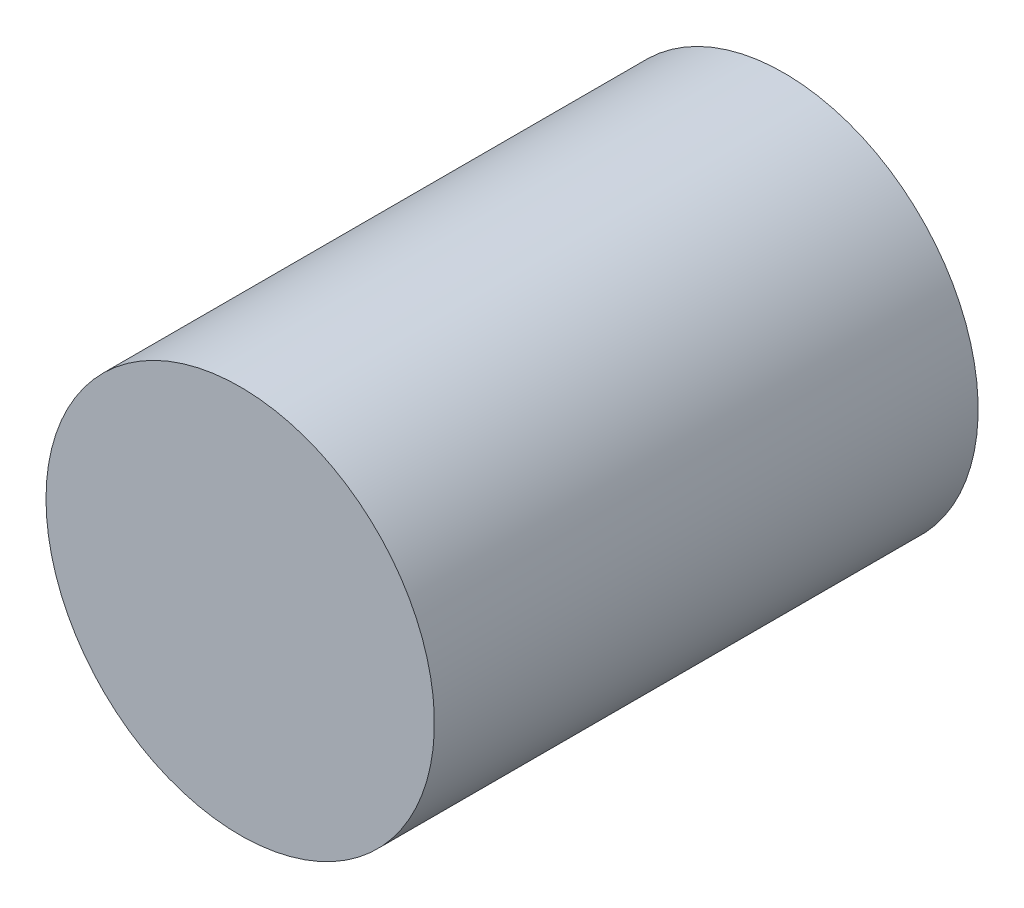
ISO-10303-21;
HEADER;
FILE_DESCRIPTION(('STEP AP214'),'2;1');
FILE_NAME('part.step','',(''),(''),'','','');
FILE_SCHEMA(('AUTOMOTIVE_DESIGN { 1 0 10303 214 1 1 1 1 }'));
ENDSEC;
DATA;
#1=APPLICATION_CONTEXT('core data for automotive mechanical design processes');
#2=APPLICATION_PROTOCOL_DEFINITION('international standard','automotive_design',2000,#1);
#3=PRODUCT_CONTEXT('',#1,'mechanical');
#4=PRODUCT('Part','Part','',(#3));
#5=PRODUCT_RELATED_PRODUCT_CATEGORY('part','',(#4));
#6=PRODUCT_DEFINITION_FORMATION('','',#4);
#7=PRODUCT_DEFINITION_CONTEXT('part definition',#1,'design');
#8=PRODUCT_DEFINITION('design','',#6,#7);
#9=PRODUCT_DEFINITION_SHAPE('','',#8);
#10=(LENGTH_UNIT() NAMED_UNIT(*) SI_UNIT(.MILLI.,.METRE.));
#11=(NAMED_UNIT(*) PLANE_ANGLE_UNIT() SI_UNIT($,.RADIAN.));
#12=(NAMED_UNIT(*) SI_UNIT($,.STERADIAN.) SOLID_ANGLE_UNIT());
#13=UNCERTAINTY_MEASURE_WITH_UNIT(LENGTH_MEASURE(1.E-05),#10,'distance_accuracy_value','');
#14=(GEOMETRIC_REPRESENTATION_CONTEXT(3) GLOBAL_UNCERTAINTY_ASSIGNED_CONTEXT((#13)) GLOBAL_UNIT_ASSIGNED_CONTEXT((#10,
#11,#12)) REPRESENTATION_CONTEXT('',''));
#15=CARTESIAN_POINT('',(0.,0.,0.));
#16=DIRECTION('',(0.,0.,1.));
#17=DIRECTION('',(1.,0.,0.));
#18=AXIS2_PLACEMENT_3D('',#15,#16,#17);
#19=CARTESIAN_POINT('',(0.,92.5,9.5));
#20=DIRECTION('',(0.,0.,-1.));
#21=DIRECTION('',(-1.,0.,0.));
#22=AXIS2_PLACEMENT_3D('',#19,#20,#21);
#23=CYLINDRICAL_SURFACE('',#22,5.);
#24=CARTESIAN_POINT('',(0.,92.5,9.5));
#25=DIRECTION('',(0.,0.,-1.));
#26=DIRECTION('',(-1.,0.,0.));
#27=AXIS2_PLACEMENT_3D('',#24,#25,#26);
#28=CIRCLE('',#27,5.);
#29=CARTESIAN_POINT('',(-5.,92.5,9.5));
#30=VERTEX_POINT('',#29);
#31=EDGE_CURVE('E10',#30,#30,#28,.T.);
#32=ORIENTED_EDGE('',*,*,#31,.T.);
#33=EDGE_LOOP('',(#32));
#34=FACE_BOUND('',#33,.T.);
#35=CARTESIAN_POINT('',(0.,92.5,-4.5));
#36=DIRECTION('',(0.,0.,-1.));
#37=DIRECTION('',(-1.,0.,0.));
#38=AXIS2_PLACEMENT_3D('',#35,#36,#37);
#39=CIRCLE('',#38,5.);
#40=CARTESIAN_POINT('',(-5.,92.5,-4.5));
#41=VERTEX_POINT('',#40);
#42=EDGE_CURVE('E38',#41,#41,#39,.T.);
#43=ORIENTED_EDGE('',*,*,#42,.F.);
#44=EDGE_LOOP('',(#43));
#45=FACE_BOUND('',#44,.T.);
#46=ADVANCED_FACE('F32',(#34,#45),#23,.T.);
#47=CARTESIAN_POINT('',(0.,92.5,9.5));
#48=DIRECTION('',(0.,0.,-1.));
#49=DIRECTION('',(-1.,0.,0.));
#50=AXIS2_PLACEMENT_3D('',#47,#48,#49);
#51=PLANE('',#50);
#52=ORIENTED_EDGE('',*,*,#31,.F.);
#53=EDGE_LOOP('',(#52));
#54=FACE_BOUND('',#53,.T.);
#55=ADVANCED_FACE('F47',(#54),#51,.F.);
#56=CARTESIAN_POINT('',(0.,92.5,-4.5));
#57=DIRECTION('',(0.,0.,-1.));
#58=DIRECTION('',(-1.,0.,0.));
#59=AXIS2_PLACEMENT_3D('',#56,#57,#58);
#60=PLANE('',#59);
#61=ORIENTED_EDGE('',*,*,#42,.T.);
#62=EDGE_LOOP('',(#61));
#63=FACE_BOUND('',#62,.T.);
#64=ADVANCED_FACE('F44',(#63),#60,.T.);
#65=CLOSED_SHELL('',(#46,#55,#64));
#66=MANIFOLD_SOLID_BREP('B2',#65);
#67=ADVANCED_BREP_SHAPE_REPRESENTATION('',(#18,#66),#14);
#68=SHAPE_DEFINITION_REPRESENTATION(#9,#67);
ENDSEC;
END-ISO-10303-21;
